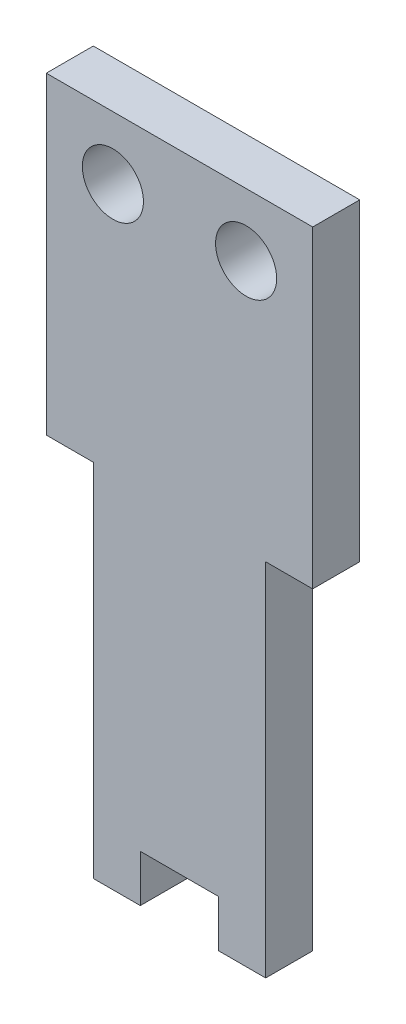
ISO-10303-21;
HEADER;
FILE_DESCRIPTION(('STEP AP214'),'2;1');
FILE_NAME('part.step','',(''),(''),'','','');
FILE_SCHEMA(('AUTOMOTIVE_DESIGN { 1 0 10303 214 1 1 1 1 }'));
ENDSEC;
DATA;
#1=APPLICATION_CONTEXT('core data for automotive mechanical design processes');
#2=APPLICATION_PROTOCOL_DEFINITION('international standard','automotive_design',2000,#1);
#3=PRODUCT_CONTEXT('',#1,'mechanical');
#4=PRODUCT('Part','Part','',(#3));
#5=PRODUCT_RELATED_PRODUCT_CATEGORY('part','',(#4));
#6=PRODUCT_DEFINITION_FORMATION('','',#4);
#7=PRODUCT_DEFINITION_CONTEXT('part definition',#1,'design');
#8=PRODUCT_DEFINITION('design','',#6,#7);
#9=PRODUCT_DEFINITION_SHAPE('','',#8);
#10=(LENGTH_UNIT() NAMED_UNIT(*) SI_UNIT(.MILLI.,.METRE.));
#11=(NAMED_UNIT(*) PLANE_ANGLE_UNIT() SI_UNIT($,.RADIAN.));
#12=(NAMED_UNIT(*) SI_UNIT($,.STERADIAN.) SOLID_ANGLE_UNIT());
#13=UNCERTAINTY_MEASURE_WITH_UNIT(LENGTH_MEASURE(1.E-05),#10,'distance_accuracy_value','');
#14=(GEOMETRIC_REPRESENTATION_CONTEXT(3) GLOBAL_UNCERTAINTY_ASSIGNED_CONTEXT((#13)) GLOBAL_UNIT_ASSIGNED_CONTEXT((#10,
#11,#12)) REPRESENTATION_CONTEXT('',''));
#15=CARTESIAN_POINT('',(0.,0.,0.));
#16=DIRECTION('',(0.,0.,1.));
#17=DIRECTION('',(1.,0.,0.));
#18=AXIS2_PLACEMENT_3D('',#15,#16,#17);
#19=CARTESIAN_POINT('',(-8.5,-20.,3.));
#20=DIRECTION('',(1.,0.,0.));
#21=DIRECTION('',(0.,0.,-1.));
#22=AXIS2_PLACEMENT_3D('',#19,#20,#21);
#23=PLANE('',#22);
#24=DIRECTION('',(0.,-1.,0.));
#25=VECTOR('',#24,1.);
#26=CARTESIAN_POINT('',(-8.5,-20.,0.));
#27=LINE('',#26,#25);
#28=CARTESIAN_POINT('',(-8.5,20.,0.));
#29=VERTEX_POINT('',#28);
#30=CARTESIAN_POINT('',(-8.5,0.,0.));
#31=VERTEX_POINT('',#30);
#32=EDGE_CURVE('E158',#29,#31,#27,.T.);
#33=ORIENTED_EDGE('',*,*,#32,.T.);
#34=DIRECTION('',(0.,0.,1.));
#35=VECTOR('',#34,1.);
#36=CARTESIAN_POINT('',(-8.5,0.,-7.));
#37=LINE('',#36,#35);
#38=CARTESIAN_POINT('',(-8.5,0.,3.));
#39=VERTEX_POINT('',#38);
#40=EDGE_CURVE('E226',#31,#39,#37,.T.);
#41=ORIENTED_EDGE('',*,*,#40,.T.);
#42=DIRECTION('',(0.,-1.,0.));
#43=VECTOR('',#42,1.);
#44=CARTESIAN_POINT('',(-8.5,-20.,3.));
#45=LINE('',#44,#43);
#46=CARTESIAN_POINT('',(-8.5,20.,3.));
#47=VERTEX_POINT('',#46);
#48=EDGE_CURVE('E177',#47,#39,#45,.T.);
#49=ORIENTED_EDGE('',*,*,#48,.F.);
#50=DIRECTION('',(0.,0.,-1.));
#51=VECTOR('',#50,1.);
#52=CARTESIAN_POINT('',(-8.5,20.,3.));
#53=LINE('',#52,#51);
#54=EDGE_CURVE('E157',#47,#29,#53,.T.);
#55=ORIENTED_EDGE('',*,*,#54,.T.);
#56=EDGE_LOOP('',(#33,#41,#49,#55));
#57=FACE_BOUND('',#56,.T.);
#58=ADVANCED_FACE('F44',(#57),#23,.F.);
#59=CARTESIAN_POINT('',(-5.5,-20.,3.));
#60=DIRECTION('',(1.,0.,0.));
#61=DIRECTION('',(0.,1.,0.));
#62=AXIS2_PLACEMENT_3D('',#59,#60,#61);
#63=PLANE('',#62);
#64=DIRECTION('',(0.,-1.,0.));
#65=VECTOR('',#64,1.);
#66=CARTESIAN_POINT('',(-5.5,-20.,0.));
#67=LINE('',#66,#65);
#68=CARTESIAN_POINT('',(-5.5,0.,0.));
#69=VERTEX_POINT('',#68);
#70=CARTESIAN_POINT('',(-5.5,-23.,0.));
#71=VERTEX_POINT('',#70);
#72=EDGE_CURVE('E161',#69,#71,#67,.T.);
#73=ORIENTED_EDGE('',*,*,#72,.T.);
#74=DIRECTION('',(0.,0.,-1.));
#75=VECTOR('',#74,1.);
#76=CARTESIAN_POINT('',(-5.5,-23.,3.));
#77=LINE('',#76,#75);
#78=CARTESIAN_POINT('',(-5.5,-23.,3.));
#79=VERTEX_POINT('',#78);
#80=EDGE_CURVE('E190',#79,#71,#77,.T.);
#81=ORIENTED_EDGE('',*,*,#80,.F.);
#82=DIRECTION('',(0.,-1.,0.));
#83=VECTOR('',#82,1.);
#84=CARTESIAN_POINT('',(-5.5,-20.,3.));
#85=LINE('',#84,#83);
#86=CARTESIAN_POINT('',(-5.5,0.,3.));
#87=VERTEX_POINT('',#86);
#88=EDGE_CURVE('E104',#87,#79,#85,.T.);
#89=ORIENTED_EDGE('',*,*,#88,.F.);
#90=DIRECTION('',(0.,0.,1.));
#91=VECTOR('',#90,1.);
#92=CARTESIAN_POINT('',(-5.5,0.,-7.));
#93=LINE('',#92,#91);
#94=EDGE_CURVE('E212',#69,#87,#93,.T.);
#95=ORIENTED_EDGE('',*,*,#94,.F.);
#96=EDGE_LOOP('',(#73,#81,#89,#95));
#97=FACE_BOUND('',#96,.T.);
#98=ADVANCED_FACE('F253',(#97),#63,.F.);
#99=CARTESIAN_POINT('',(-5.5,-23.,3.));
#100=DIRECTION('',(0.,1.,0.));
#101=DIRECTION('',(-1.,0.,0.));
#102=AXIS2_PLACEMENT_3D('',#99,#100,#101);
#103=PLANE('',#102);
#104=DIRECTION('',(1.,0.,0.));
#105=VECTOR('',#104,1.);
#106=CARTESIAN_POINT('',(-5.5,-23.,0.));
#107=LINE('',#106,#105);
#108=CARTESIAN_POINT('',(-2.5,-23.,0.));
#109=VERTEX_POINT('',#108);
#110=EDGE_CURVE('E164',#71,#109,#107,.T.);
#111=ORIENTED_EDGE('',*,*,#110,.T.);
#112=DIRECTION('',(0.,0.,-1.));
#113=VECTOR('',#112,1.);
#114=CARTESIAN_POINT('',(-2.5,-23.,3.));
#115=LINE('',#114,#113);
#116=CARTESIAN_POINT('',(-2.5,-23.,3.));
#117=VERTEX_POINT('',#116);
#118=EDGE_CURVE('E187',#117,#109,#115,.T.);
#119=ORIENTED_EDGE('',*,*,#118,.F.);
#120=DIRECTION('',(1.,0.,0.));
#121=VECTOR('',#120,1.);
#122=CARTESIAN_POINT('',(-5.5,-23.,3.));
#123=LINE('',#122,#121);
#124=EDGE_CURVE('E229',#79,#117,#123,.T.);
#125=ORIENTED_EDGE('',*,*,#124,.F.);
#126=ORIENTED_EDGE('',*,*,#80,.T.);
#127=EDGE_LOOP('',(#111,#119,#125,#126));
#128=FACE_BOUND('',#127,.T.);
#129=ADVANCED_FACE('F251',(#128),#103,.F.);
#130=CARTESIAN_POINT('',(-2.5,-20.,3.));
#131=DIRECTION('',(-1.,0.,0.));
#132=DIRECTION('',(0.,-1.,0.));
#133=AXIS2_PLACEMENT_3D('',#130,#131,#132);
#134=PLANE('',#133);
#135=DIRECTION('',(0.,1.,0.));
#136=VECTOR('',#135,1.);
#137=CARTESIAN_POINT('',(-2.5,-20.,0.));
#138=LINE('',#137,#136);
#139=CARTESIAN_POINT('',(-2.5,-20.,0.));
#140=VERTEX_POINT('',#139);
#141=EDGE_CURVE('E166',#109,#140,#138,.T.);
#142=ORIENTED_EDGE('',*,*,#141,.T.);
#143=DIRECTION('',(0.,0.,-1.));
#144=VECTOR('',#143,1.);
#145=CARTESIAN_POINT('',(-2.5,-20.,3.));
#146=LINE('',#145,#144);
#147=CARTESIAN_POINT('',(-2.5,-20.,3.));
#148=VERTEX_POINT('',#147);
#149=EDGE_CURVE('E184',#148,#140,#146,.T.);
#150=ORIENTED_EDGE('',*,*,#149,.F.);
#151=DIRECTION('',(0.,1.,0.));
#152=VECTOR('',#151,1.);
#153=CARTESIAN_POINT('',(-2.5,-20.,3.));
#154=LINE('',#153,#152);
#155=EDGE_CURVE('E231',#117,#148,#154,.T.);
#156=ORIENTED_EDGE('',*,*,#155,.F.);
#157=ORIENTED_EDGE('',*,*,#118,.T.);
#158=EDGE_LOOP('',(#142,#150,#156,#157));
#159=FACE_BOUND('',#158,.T.);
#160=ADVANCED_FACE('F247',(#159),#134,.F.);
#161=CARTESIAN_POINT('',(2.5,-20.,3.));
#162=DIRECTION('',(0.,1.,0.));
#163=DIRECTION('',(0.,0.,1.));
#164=AXIS2_PLACEMENT_3D('',#161,#162,#163);
#165=PLANE('',#164);
#166=DIRECTION('',(1.,0.,0.));
#167=VECTOR('',#166,1.);
#168=CARTESIAN_POINT('',(2.5,-20.,0.));
#169=LINE('',#168,#167);
#170=CARTESIAN_POINT('',(2.5,-20.,0.));
#171=VERTEX_POINT('',#170);
#172=EDGE_CURVE('E168',#140,#171,#169,.T.);
#173=ORIENTED_EDGE('',*,*,#172,.T.);
#174=DIRECTION('',(0.,0.,-1.));
#175=VECTOR('',#174,1.);
#176=CARTESIAN_POINT('',(2.5,-20.,3.));
#177=LINE('',#176,#175);
#178=CARTESIAN_POINT('',(2.5,-20.,3.));
#179=VERTEX_POINT('',#178);
#180=EDGE_CURVE('E181',#179,#171,#177,.T.);
#181=ORIENTED_EDGE('',*,*,#180,.F.);
#182=DIRECTION('',(1.,0.,0.));
#183=VECTOR('',#182,1.);
#184=CARTESIAN_POINT('',(2.5,-20.,3.));
#185=LINE('',#184,#183);
#186=EDGE_CURVE('E233',#148,#179,#185,.T.);
#187=ORIENTED_EDGE('',*,*,#186,.F.);
#188=ORIENTED_EDGE('',*,*,#149,.T.);
#189=EDGE_LOOP('',(#173,#181,#187,#188));
#190=FACE_BOUND('',#189,.T.);
#191=ADVANCED_FACE('F239',(#190),#165,.F.);
#192=CARTESIAN_POINT('',(2.5,-20.,3.));
#193=DIRECTION('',(1.,0.,0.));
#194=DIRECTION('',(0.,1.,0.));
#195=AXIS2_PLACEMENT_3D('',#192,#193,#194);
#196=PLANE('',#195);
#197=DIRECTION('',(0.,-1.,0.));
#198=VECTOR('',#197,1.);
#199=CARTESIAN_POINT('',(2.5,-20.,0.));
#200=LINE('',#199,#198);
#201=CARTESIAN_POINT('',(2.5,-23.,0.));
#202=VERTEX_POINT('',#201);
#203=EDGE_CURVE('E170',#171,#202,#200,.T.);
#204=ORIENTED_EDGE('',*,*,#203,.T.);
#205=DIRECTION('',(0.,0.,-1.));
#206=VECTOR('',#205,1.);
#207=CARTESIAN_POINT('',(2.5,-23.,3.));
#208=LINE('',#207,#206);
#209=CARTESIAN_POINT('',(2.5,-23.,3.));
#210=VERTEX_POINT('',#209);
#211=EDGE_CURVE('E144',#210,#202,#208,.T.);
#212=ORIENTED_EDGE('',*,*,#211,.F.);
#213=DIRECTION('',(0.,-1.,0.));
#214=VECTOR('',#213,1.);
#215=CARTESIAN_POINT('',(2.5,-20.,3.));
#216=LINE('',#215,#214);
#217=EDGE_CURVE('E131',#179,#210,#216,.T.);
#218=ORIENTED_EDGE('',*,*,#217,.F.);
#219=ORIENTED_EDGE('',*,*,#180,.T.);
#220=EDGE_LOOP('',(#204,#212,#218,#219));
#221=FACE_BOUND('',#220,.T.);
#222=ADVANCED_FACE('F243',(#221),#196,.F.);
#223=CARTESIAN_POINT('',(5.50000000000001,-23.,3.));
#224=DIRECTION('',(0.,1.,0.));
#225=DIRECTION('',(-1.,0.,0.));
#226=AXIS2_PLACEMENT_3D('',#223,#224,#225);
#227=PLANE('',#226);
#228=DIRECTION('',(1.,0.,0.));
#229=VECTOR('',#228,1.);
#230=CARTESIAN_POINT('',(5.50000000000001,-23.,0.));
#231=LINE('',#230,#229);
#232=CARTESIAN_POINT('',(5.50000000000001,-23.,0.));
#233=VERTEX_POINT('',#232);
#234=EDGE_CURVE('E140',#202,#233,#231,.T.);
#235=ORIENTED_EDGE('',*,*,#234,.T.);
#236=DIRECTION('',(0.,0.,-1.));
#237=VECTOR('',#236,1.);
#238=CARTESIAN_POINT('',(5.50000000000001,-23.,3.));
#239=LINE('',#238,#237);
#240=CARTESIAN_POINT('',(5.50000000000001,-23.,3.));
#241=VERTEX_POINT('',#240);
#242=EDGE_CURVE('E137',#241,#233,#239,.T.);
#243=ORIENTED_EDGE('',*,*,#242,.F.);
#244=DIRECTION('',(1.,0.,0.));
#245=VECTOR('',#244,1.);
#246=CARTESIAN_POINT('',(5.50000000000001,-23.,3.));
#247=LINE('',#246,#245);
#248=EDGE_CURVE('E121',#210,#241,#247,.T.);
#249=ORIENTED_EDGE('',*,*,#248,.F.);
#250=ORIENTED_EDGE('',*,*,#211,.T.);
#251=EDGE_LOOP('',(#235,#243,#249,#250));
#252=FACE_BOUND('',#251,.T.);
#253=ADVANCED_FACE('F138',(#252),#227,.F.);
#254=CARTESIAN_POINT('',(5.5,-20.,3.));
#255=DIRECTION('',(-1.,0.,0.));
#256=DIRECTION('',(0.,-1.,0.));
#257=AXIS2_PLACEMENT_3D('',#254,#255,#256);
#258=PLANE('',#257);
#259=DIRECTION('',(0.,1.,0.));
#260=VECTOR('',#259,1.);
#261=CARTESIAN_POINT('',(5.5,-20.,0.));
#262=LINE('',#261,#260);
#263=CARTESIAN_POINT('',(5.5,0.,0.));
#264=VERTEX_POINT('',#263);
#265=EDGE_CURVE('E173',#233,#264,#262,.T.);
#266=ORIENTED_EDGE('',*,*,#265,.T.);
#267=DIRECTION('',(0.,0.,1.));
#268=VECTOR('',#267,1.);
#269=CARTESIAN_POINT('',(5.5,0.,-7.));
#270=LINE('',#269,#268);
#271=CARTESIAN_POINT('',(5.5,0.,3.));
#272=VERTEX_POINT('',#271);
#273=EDGE_CURVE('E149',#264,#272,#270,.T.);
#274=ORIENTED_EDGE('',*,*,#273,.T.);
#275=DIRECTION('',(0.,1.,0.));
#276=VECTOR('',#275,1.);
#277=CARTESIAN_POINT('',(5.5,-20.,3.));
#278=LINE('',#277,#276);
#279=EDGE_CURVE('E128',#241,#272,#278,.T.);
#280=ORIENTED_EDGE('',*,*,#279,.F.);
#281=ORIENTED_EDGE('',*,*,#242,.T.);
#282=EDGE_LOOP('',(#266,#274,#280,#281));
#283=FACE_BOUND('',#282,.T.);
#284=ADVANCED_FACE('F147',(#283),#258,.F.);
#285=CARTESIAN_POINT('',(8.5,-20.,3.));
#286=DIRECTION('',(-1.,0.,0.));
#287=DIRECTION('',(0.,0.,1.));
#288=AXIS2_PLACEMENT_3D('',#285,#286,#287);
#289=PLANE('',#288);
#290=DIRECTION('',(0.,1.,0.));
#291=VECTOR('',#290,1.);
#292=CARTESIAN_POINT('',(8.5,-20.,3.));
#293=LINE('',#292,#291);
#294=CARTESIAN_POINT('',(8.5,0.,3.));
#295=VERTEX_POINT('',#294);
#296=CARTESIAN_POINT('',(8.5,20.,3.));
#297=VERTEX_POINT('',#296);
#298=EDGE_CURVE('E151',#295,#297,#293,.T.);
#299=ORIENTED_EDGE('',*,*,#298,.F.);
#300=DIRECTION('',(0.,0.,1.));
#301=VECTOR('',#300,1.);
#302=CARTESIAN_POINT('',(8.5,0.,-7.));
#303=LINE('',#302,#301);
#304=CARTESIAN_POINT('',(8.5,0.,0.));
#305=VERTEX_POINT('',#304);
#306=EDGE_CURVE('E202',#305,#295,#303,.T.);
#307=ORIENTED_EDGE('',*,*,#306,.F.);
#308=DIRECTION('',(0.,1.,0.));
#309=VECTOR('',#308,1.);
#310=CARTESIAN_POINT('',(8.5,-20.,0.));
#311=LINE('',#310,#309);
#312=CARTESIAN_POINT('',(8.5,20.,0.));
#313=VERTEX_POINT('',#312);
#314=EDGE_CURVE('E90',#305,#313,#311,.T.);
#315=ORIENTED_EDGE('',*,*,#314,.T.);
#316=DIRECTION('',(0.,0.,-1.));
#317=VECTOR('',#316,1.);
#318=CARTESIAN_POINT('',(8.5,20.,3.));
#319=LINE('',#318,#317);
#320=EDGE_CURVE('E145',#297,#313,#319,.T.);
#321=ORIENTED_EDGE('',*,*,#320,.F.);
#322=EDGE_LOOP('',(#299,#307,#315,#321));
#323=FACE_BOUND('',#322,.T.);
#324=ADVANCED_FACE('F205',(#323),#289,.F.);
#325=CARTESIAN_POINT('',(8.5,20.,3.));
#326=DIRECTION('',(0.,-1.,0.));
#327=DIRECTION('',(0.,0.,-1.));
#328=AXIS2_PLACEMENT_3D('',#325,#326,#327);
#329=PLANE('',#328);
#330=DIRECTION('',(-1.,0.,0.));
#331=VECTOR('',#330,1.);
#332=CARTESIAN_POINT('',(8.5,20.,0.));
#333=LINE('',#332,#331);
#334=EDGE_CURVE('E96',#313,#29,#333,.T.);
#335=ORIENTED_EDGE('',*,*,#334,.T.);
#336=ORIENTED_EDGE('',*,*,#54,.F.);
#337=DIRECTION('',(-1.,0.,0.));
#338=VECTOR('',#337,1.);
#339=CARTESIAN_POINT('',(8.5,20.,3.));
#340=LINE('',#339,#338);
#341=EDGE_CURVE('E60',#297,#47,#340,.T.);
#342=ORIENTED_EDGE('',*,*,#341,.F.);
#343=ORIENTED_EDGE('',*,*,#320,.T.);
#344=EDGE_LOOP('',(#335,#336,#342,#343));
#345=FACE_BOUND('',#344,.T.);
#346=ADVANCED_FACE('F275',(#345),#329,.F.);
#347=CARTESIAN_POINT('',(0.,0.,3.));
#348=DIRECTION('',(0.,0.,1.));
#349=DIRECTION('',(1.,0.,0.));
#350=AXIS2_PLACEMENT_3D('',#347,#348,#349);
#351=PLANE('',#350);
#352=DIRECTION('',(-1.,0.,0.));
#353=VECTOR('',#352,1.);
#354=CARTESIAN_POINT('',(-8.5,0.,3.));
#355=LINE('',#354,#353);
#356=EDGE_CURVE('E208',#87,#39,#355,.T.);
#357=ORIENTED_EDGE('',*,*,#356,.F.);
#358=ORIENTED_EDGE('',*,*,#88,.T.);
#359=ORIENTED_EDGE('',*,*,#124,.T.);
#360=ORIENTED_EDGE('',*,*,#155,.T.);
#361=ORIENTED_EDGE('',*,*,#186,.T.);
#362=ORIENTED_EDGE('',*,*,#217,.T.);
#363=ORIENTED_EDGE('',*,*,#248,.T.);
#364=ORIENTED_EDGE('',*,*,#279,.T.);
#365=DIRECTION('',(-1.,0.,0.));
#366=VECTOR('',#365,1.);
#367=CARTESIAN_POINT('',(5.5,0.,3.));
#368=LINE('',#367,#366);
#369=EDGE_CURVE('E206',#295,#272,#368,.T.);
#370=ORIENTED_EDGE('',*,*,#369,.F.);
#371=ORIENTED_EDGE('',*,*,#298,.T.);
#372=ORIENTED_EDGE('',*,*,#341,.T.);
#373=ORIENTED_EDGE('',*,*,#48,.T.);
#374=EDGE_LOOP('',(#357,#358,#359,#360,#361,#362,#363,#364,#370,#371,#372,#373));
#375=FACE_BOUND('',#374,.T.);
#376=CARTESIAN_POINT('',(-4.25,16.,3.));
#377=DIRECTION('',(0.,0.,1.));
#378=DIRECTION('',(1.,0.,0.));
#379=AXIS2_PLACEMENT_3D('',#376,#377,#378);
#380=CIRCLE('',#379,1.95);
#381=CARTESIAN_POINT('',(-2.3,16.,3.));
#382=VERTEX_POINT('',#381);
#383=EDGE_CURVE('E217',#382,#382,#380,.T.);
#384=ORIENTED_EDGE('',*,*,#383,.F.);
#385=EDGE_LOOP('',(#384));
#386=FACE_BOUND('',#385,.T.);
#387=CARTESIAN_POINT('',(4.25,16.,3.));
#388=DIRECTION('',(0.,0.,1.));
#389=DIRECTION('',(1.,0.,0.));
#390=AXIS2_PLACEMENT_3D('',#387,#388,#389);
#391=CIRCLE('',#390,1.95);
#392=CARTESIAN_POINT('',(6.2,16.,3.));
#393=VERTEX_POINT('',#392);
#394=EDGE_CURVE('E220',#393,#393,#391,.T.);
#395=ORIENTED_EDGE('',*,*,#394,.F.);
#396=EDGE_LOOP('',(#395));
#397=FACE_BOUND('',#396,.T.);
#398=ADVANCED_FACE('F123',(#375,#386,#397),#351,.T.);
#399=CARTESIAN_POINT('',(0.,0.,0.));
#400=DIRECTION('',(0.,0.,1.));
#401=DIRECTION('',(1.,0.,0.));
#402=AXIS2_PLACEMENT_3D('',#399,#400,#401);
#403=PLANE('',#402);
#404=CARTESIAN_POINT('',(-4.25,16.,0.));
#405=DIRECTION('',(0.,0.,1.));
#406=DIRECTION('',(1.,0.,0.));
#407=AXIS2_PLACEMENT_3D('',#404,#405,#406);
#408=CIRCLE('',#407,1.95);
#409=CARTESIAN_POINT('',(-2.3,16.,0.));
#410=VERTEX_POINT('',#409);
#411=EDGE_CURVE('E162',#410,#410,#408,.T.);
#412=ORIENTED_EDGE('',*,*,#411,.T.);
#413=EDGE_LOOP('',(#412));
#414=FACE_BOUND('',#413,.T.);
#415=CARTESIAN_POINT('',(4.25,16.,0.));
#416=DIRECTION('',(0.,0.,1.));
#417=DIRECTION('',(1.,0.,0.));
#418=AXIS2_PLACEMENT_3D('',#415,#416,#417);
#419=CIRCLE('',#418,1.95);
#420=CARTESIAN_POINT('',(6.2,16.,0.));
#421=VERTEX_POINT('',#420);
#422=EDGE_CURVE('E223',#421,#421,#419,.T.);
#423=ORIENTED_EDGE('',*,*,#422,.T.);
#424=EDGE_LOOP('',(#423));
#425=FACE_BOUND('',#424,.T.);
#426=ORIENTED_EDGE('',*,*,#72,.F.);
#427=DIRECTION('',(-1.,0.,0.));
#428=VECTOR('',#427,1.);
#429=CARTESIAN_POINT('',(0.,0.,0.));
#430=LINE('',#429,#428);
#431=EDGE_CURVE('E11',#69,#31,#430,.T.);
#432=ORIENTED_EDGE('',*,*,#431,.T.);
#433=ORIENTED_EDGE('',*,*,#32,.F.);
#434=ORIENTED_EDGE('',*,*,#334,.F.);
#435=ORIENTED_EDGE('',*,*,#314,.F.);
#436=DIRECTION('',(-1.,0.,0.));
#437=VECTOR('',#436,1.);
#438=CARTESIAN_POINT('',(0.,0.,0.));
#439=LINE('',#438,#437);
#440=EDGE_CURVE('E52',#305,#264,#439,.T.);
#441=ORIENTED_EDGE('',*,*,#440,.T.);
#442=ORIENTED_EDGE('',*,*,#265,.F.);
#443=ORIENTED_EDGE('',*,*,#234,.F.);
#444=ORIENTED_EDGE('',*,*,#203,.F.);
#445=ORIENTED_EDGE('',*,*,#172,.F.);
#446=ORIENTED_EDGE('',*,*,#141,.F.);
#447=ORIENTED_EDGE('',*,*,#110,.F.);
#448=EDGE_LOOP('',(#426,#432,#433,#434,#435,#441,#442,#443,#444,#445,#446,#447));
#449=FACE_BOUND('',#448,.T.);
#450=ADVANCED_FACE('F196',(#414,#425,#449),#403,.F.);
#451=CARTESIAN_POINT('',(4.25,16.,0.));
#452=DIRECTION('',(0.,0.,1.));
#453=DIRECTION('',(1.,0.,0.));
#454=AXIS2_PLACEMENT_3D('',#451,#452,#453);
#455=CYLINDRICAL_SURFACE('',#454,1.95);
#456=ORIENTED_EDGE('',*,*,#422,.F.);
#457=EDGE_LOOP('',(#456));
#458=FACE_BOUND('',#457,.T.);
#459=ORIENTED_EDGE('',*,*,#394,.T.);
#460=EDGE_LOOP('',(#459));
#461=FACE_BOUND('',#460,.T.);
#462=ADVANCED_FACE('F357',(#458,#461),#455,.F.);
#463=CARTESIAN_POINT('',(-4.25,16.,0.));
#464=DIRECTION('',(0.,0.,1.));
#465=DIRECTION('',(1.,0.,0.));
#466=AXIS2_PLACEMENT_3D('',#463,#464,#465);
#467=CYLINDRICAL_SURFACE('',#466,1.95);
#468=ORIENTED_EDGE('',*,*,#411,.F.);
#469=EDGE_LOOP('',(#468));
#470=FACE_BOUND('',#469,.T.);
#471=ORIENTED_EDGE('',*,*,#383,.T.);
#472=EDGE_LOOP('',(#471));
#473=FACE_BOUND('',#472,.T.);
#474=ADVANCED_FACE('F315',(#470,#473),#467,.F.);
#475=CARTESIAN_POINT('',(-8.5,0.,-7.));
#476=DIRECTION('',(0.,1.,0.));
#477=DIRECTION('',(0.,0.,1.));
#478=AXIS2_PLACEMENT_3D('',#475,#476,#477);
#479=PLANE('',#478);
#480=ORIENTED_EDGE('',*,*,#94,.T.);
#481=ORIENTED_EDGE('',*,*,#356,.T.);
#482=ORIENTED_EDGE('',*,*,#40,.F.);
#483=ORIENTED_EDGE('',*,*,#431,.F.);
#484=EDGE_LOOP('',(#480,#481,#482,#483));
#485=FACE_BOUND('',#484,.T.);
#486=ADVANCED_FACE('F264',(#485),#479,.F.);
#487=CARTESIAN_POINT('',(5.5,0.,-7.));
#488=DIRECTION('',(0.,1.,0.));
#489=DIRECTION('',(0.,0.,1.));
#490=AXIS2_PLACEMENT_3D('',#487,#488,#489);
#491=PLANE('',#490);
#492=ORIENTED_EDGE('',*,*,#306,.T.);
#493=ORIENTED_EDGE('',*,*,#369,.T.);
#494=ORIENTED_EDGE('',*,*,#273,.F.);
#495=ORIENTED_EDGE('',*,*,#440,.F.);
#496=EDGE_LOOP('',(#492,#493,#494,#495));
#497=FACE_BOUND('',#496,.T.);
#498=ADVANCED_FACE('F200',(#497),#491,.F.);
#499=CLOSED_SHELL('',(#58,#98,#129,#160,#191,#222,#253,#284,#324,#346,#398,#450,#462,#474,#486,#498));
#500=MANIFOLD_SOLID_BREP('B2',#499);
#501=ADVANCED_BREP_SHAPE_REPRESENTATION('',(#18,#500),#14);
#502=SHAPE_DEFINITION_REPRESENTATION(#9,#501);
ENDSEC;
END-ISO-10303-21;
